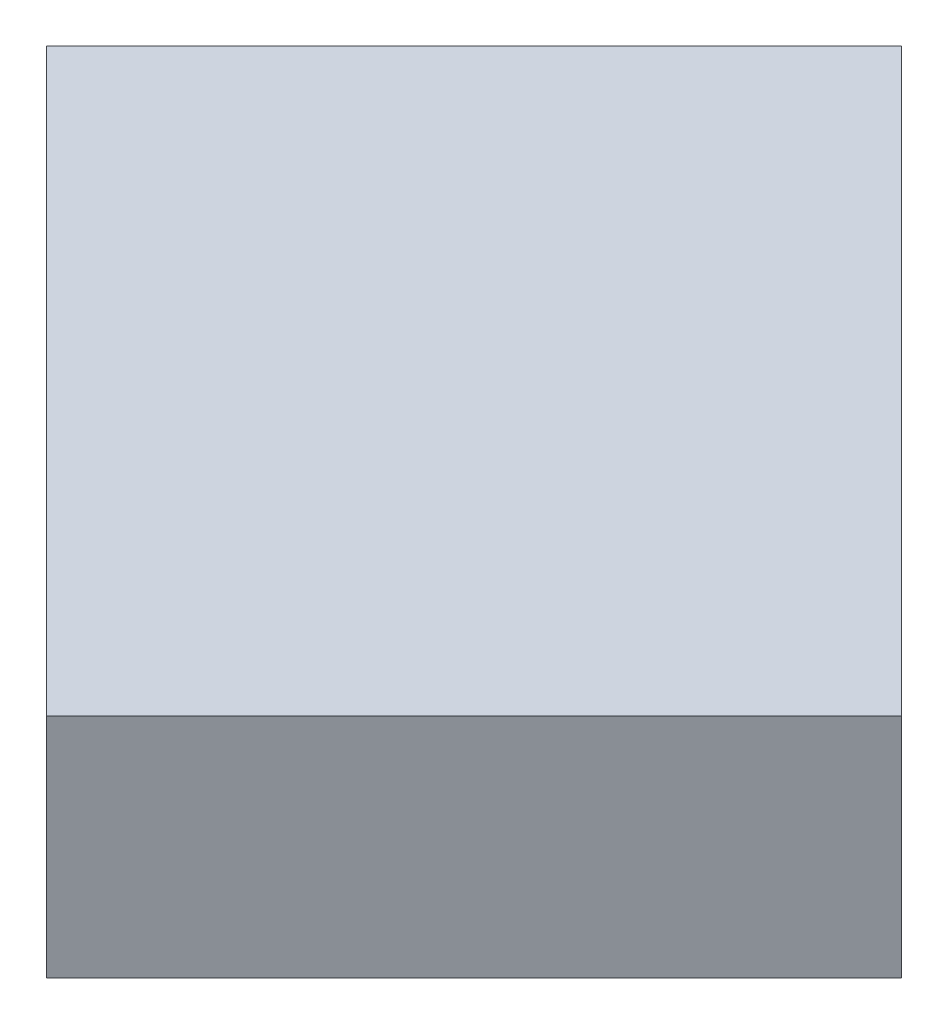
ISO-10303-21;
HEADER;
FILE_DESCRIPTION(('STEP AP214'),'2;1');
FILE_NAME('part.step','',(''),(''),'','','');
FILE_SCHEMA(('AUTOMOTIVE_DESIGN { 1 0 10303 214 1 1 1 1 }'));
ENDSEC;
DATA;
#1=APPLICATION_CONTEXT('core data for automotive mechanical design processes');
#2=APPLICATION_PROTOCOL_DEFINITION('international standard','automotive_design',2000,#1);
#3=PRODUCT_CONTEXT('',#1,'mechanical');
#4=PRODUCT('Part','Part','',(#3));
#5=PRODUCT_RELATED_PRODUCT_CATEGORY('part','',(#4));
#6=PRODUCT_DEFINITION_FORMATION('','',#4);
#7=PRODUCT_DEFINITION_CONTEXT('part definition',#1,'design');
#8=PRODUCT_DEFINITION('design','',#6,#7);
#9=PRODUCT_DEFINITION_SHAPE('','',#8);
#10=(LENGTH_UNIT() NAMED_UNIT(*) SI_UNIT(.MILLI.,.METRE.));
#11=(NAMED_UNIT(*) PLANE_ANGLE_UNIT() SI_UNIT($,.RADIAN.));
#12=(NAMED_UNIT(*) SI_UNIT($,.STERADIAN.) SOLID_ANGLE_UNIT());
#13=UNCERTAINTY_MEASURE_WITH_UNIT(LENGTH_MEASURE(1.E-05),#10,'distance_accuracy_value','');
#14=(GEOMETRIC_REPRESENTATION_CONTEXT(3) GLOBAL_UNCERTAINTY_ASSIGNED_CONTEXT((#13)) GLOBAL_UNIT_ASSIGNED_CONTEXT((#10,
#11,#12)) REPRESENTATION_CONTEXT('',''));
#15=CARTESIAN_POINT('',(0.,0.,0.));
#16=DIRECTION('',(0.,0.,1.));
#17=DIRECTION('',(1.,0.,0.));
#18=AXIS2_PLACEMENT_3D('',#15,#16,#17);
#19=CARTESIAN_POINT('',(-14.7078210486803,6.62,-2.22738636073754));
#20=DIRECTION('',(0.707106781186547,0.,0.707106781186548));
#21=DIRECTION('',(0.707106781186548,0.,-0.707106781186547));
#22=AXIS2_PLACEMENT_3D('',#19,#20,#21);
#23=PLANE('',#22);
#24=DIRECTION('',(-0.707106781186548,0.,0.707106781186547));
#25=VECTOR('',#24,1.);
#26=CARTESIAN_POINT('',(-14.7078210486803,0.,-2.22738636073754));
#27=LINE('',#26,#25);
#28=CARTESIAN_POINT('',(-2.22738636073752,0.,-14.7078210486803));
#29=VERTEX_POINT('',#28);
#30=CARTESIAN_POINT('',(-14.7078210486803,0.,-2.22738636073754));
#31=VERTEX_POINT('',#30);
#32=EDGE_CURVE('E101',#29,#31,#27,.T.);
#33=ORIENTED_EDGE('',*,*,#32,.T.);
#34=DIRECTION('',(0.,-1.,0.));
#35=VECTOR('',#34,1.);
#36=CARTESIAN_POINT('',(-14.7078210486803,6.62,-2.22738636073754));
#37=LINE('',#36,#35);
#38=CARTESIAN_POINT('',(-14.7078210486803,6.62,-2.22738636073754));
#39=VERTEX_POINT('',#38);
#40=EDGE_CURVE('E11',#39,#31,#37,.T.);
#41=ORIENTED_EDGE('',*,*,#40,.F.);
#42=DIRECTION('',(-0.707106781186548,0.,0.707106781186547));
#43=VECTOR('',#42,1.);
#44=CARTESIAN_POINT('',(-14.7078210486803,6.62,-2.22738636073754));
#45=LINE('',#44,#43);
#46=CARTESIAN_POINT('',(-2.22738636073752,6.62,-14.7078210486803));
#47=VERTEX_POINT('',#46);
#48=EDGE_CURVE('E89',#47,#39,#45,.T.);
#49=ORIENTED_EDGE('',*,*,#48,.F.);
#50=DIRECTION('',(0.,-1.,0.));
#51=VECTOR('',#50,1.);
#52=CARTESIAN_POINT('',(-2.22738636073752,6.62,-14.7078210486803));
#53=LINE('',#52,#51);
#54=EDGE_CURVE('E97',#47,#29,#53,.T.);
#55=ORIENTED_EDGE('',*,*,#54,.T.);
#56=EDGE_LOOP('',(#33,#41,#49,#55));
#57=FACE_BOUND('',#56,.T.);
#58=ADVANCED_FACE('F38',(#57),#23,.F.);
#59=CARTESIAN_POINT('',(-14.7078210486803,6.62,-2.22738636073754));
#60=DIRECTION('',(0.707106781186548,0.,-0.707106781186547));
#61=DIRECTION('',(-0.707106781186547,0.,-0.707106781186548));
#62=AXIS2_PLACEMENT_3D('',#59,#60,#61);
#63=PLANE('',#62);
#64=DIRECTION('',(0.707106781186547,0.,0.707106781186548));
#65=VECTOR('',#64,1.);
#66=CARTESIAN_POINT('',(-14.7078210486803,0.,-2.22738636073754));
#67=LINE('',#66,#65);
#68=CARTESIAN_POINT('',(2.22738636073751,0.,14.7078210486803));
#69=VERTEX_POINT('',#68);
#70=EDGE_CURVE('E93',#31,#69,#67,.T.);
#71=ORIENTED_EDGE('',*,*,#70,.T.);
#72=DIRECTION('',(0.,-1.,0.));
#73=VECTOR('',#72,1.);
#74=CARTESIAN_POINT('',(2.22738636073751,6.62,14.7078210486803));
#75=LINE('',#74,#73);
#76=CARTESIAN_POINT('',(2.22738636073751,6.62,14.7078210486803));
#77=VERTEX_POINT('',#76);
#78=EDGE_CURVE('E46',#77,#69,#75,.T.);
#79=ORIENTED_EDGE('',*,*,#78,.F.);
#80=DIRECTION('',(0.707106781186547,0.,0.707106781186548));
#81=VECTOR('',#80,1.);
#82=CARTESIAN_POINT('',(-14.7078210486803,6.62,-2.22738636073754));
#83=LINE('',#82,#81);
#84=EDGE_CURVE('E84',#39,#77,#83,.T.);
#85=ORIENTED_EDGE('',*,*,#84,.F.);
#86=ORIENTED_EDGE('',*,*,#40,.T.);
#87=EDGE_LOOP('',(#71,#79,#85,#86));
#88=FACE_BOUND('',#87,.T.);
#89=ADVANCED_FACE('F92',(#88),#63,.F.);
#90=CARTESIAN_POINT('',(2.22738636073751,6.62,14.7078210486803));
#91=DIRECTION('',(-0.707106781186547,0.,-0.707106781186548));
#92=DIRECTION('',(-0.707106781186548,0.,0.707106781186547));
#93=AXIS2_PLACEMENT_3D('',#90,#91,#92);
#94=PLANE('',#93);
#95=DIRECTION('',(0.707106781186548,0.,-0.707106781186547));
#96=VECTOR('',#95,1.);
#97=CARTESIAN_POINT('',(2.22738636073751,0.,14.7078210486803));
#98=LINE('',#97,#96);
#99=CARTESIAN_POINT('',(14.7078210486803,0.,2.22738636073752));
#100=VERTEX_POINT('',#99);
#101=EDGE_CURVE('E71',#69,#100,#98,.T.);
#102=ORIENTED_EDGE('',*,*,#101,.T.);
#103=DIRECTION('',(0.,-1.,0.));
#104=VECTOR('',#103,1.);
#105=CARTESIAN_POINT('',(14.7078210486803,6.62,2.22738636073752));
#106=LINE('',#105,#104);
#107=CARTESIAN_POINT('',(14.7078210486803,6.62,2.22738636073752));
#108=VERTEX_POINT('',#107);
#109=EDGE_CURVE('E94',#108,#100,#106,.T.);
#110=ORIENTED_EDGE('',*,*,#109,.F.);
#111=DIRECTION('',(0.707106781186548,0.,-0.707106781186547));
#112=VECTOR('',#111,1.);
#113=CARTESIAN_POINT('',(2.22738636073751,6.62,14.7078210486803));
#114=LINE('',#113,#112);
#115=EDGE_CURVE('E87',#77,#108,#114,.T.);
#116=ORIENTED_EDGE('',*,*,#115,.F.);
#117=ORIENTED_EDGE('',*,*,#78,.T.);
#118=EDGE_LOOP('',(#102,#110,#116,#117));
#119=FACE_BOUND('',#118,.T.);
#120=ADVANCED_FACE('F95',(#119),#94,.F.);
#121=CARTESIAN_POINT('',(-2.22738636073752,6.62,-14.7078210486803));
#122=DIRECTION('',(-0.707106781186548,0.,0.707106781186547));
#123=DIRECTION('',(0.707106781186547,0.,0.707106781186548));
#124=AXIS2_PLACEMENT_3D('',#121,#122,#123);
#125=PLANE('',#124);
#126=DIRECTION('',(-0.707106781186547,0.,-0.707106781186548));
#127=VECTOR('',#126,1.);
#128=CARTESIAN_POINT('',(-2.22738636073752,0.,-14.7078210486803));
#129=LINE('',#128,#127);
#130=EDGE_CURVE('E77',#100,#29,#129,.T.);
#131=ORIENTED_EDGE('',*,*,#130,.T.);
#132=ORIENTED_EDGE('',*,*,#54,.F.);
#133=DIRECTION('',(-0.707106781186547,0.,-0.707106781186548));
#134=VECTOR('',#133,1.);
#135=CARTESIAN_POINT('',(-2.22738636073752,6.62,-14.7078210486803));
#136=LINE('',#135,#134);
#137=EDGE_CURVE('E54',#108,#47,#136,.T.);
#138=ORIENTED_EDGE('',*,*,#137,.F.);
#139=ORIENTED_EDGE('',*,*,#109,.T.);
#140=EDGE_LOOP('',(#131,#132,#138,#139));
#141=FACE_BOUND('',#140,.T.);
#142=ADVANCED_FACE('F108',(#141),#125,.F.);
#143=CARTESIAN_POINT('',(0.,6.62,0.));
#144=DIRECTION('',(0.,-1.,0.));
#145=DIRECTION('',(0.,0.,-1.));
#146=AXIS2_PLACEMENT_3D('',#143,#144,#145);
#147=PLANE('',#146);
#148=ORIENTED_EDGE('',*,*,#48,.T.);
#149=ORIENTED_EDGE('',*,*,#84,.T.);
#150=ORIENTED_EDGE('',*,*,#115,.T.);
#151=ORIENTED_EDGE('',*,*,#137,.T.);
#152=EDGE_LOOP('',(#148,#149,#150,#151));
#153=FACE_BOUND('',#152,.T.);
#154=ADVANCED_FACE('F85',(#153),#147,.F.);
#155=CARTESIAN_POINT('',(0.,0.,0.));
#156=DIRECTION('',(0.,-1.,0.));
#157=DIRECTION('',(0.,0.,-1.));
#158=AXIS2_PLACEMENT_3D('',#155,#156,#157);
#159=PLANE('',#158);
#160=ORIENTED_EDGE('',*,*,#32,.F.);
#161=ORIENTED_EDGE('',*,*,#130,.F.);
#162=ORIENTED_EDGE('',*,*,#101,.F.);
#163=ORIENTED_EDGE('',*,*,#70,.F.);
#164=EDGE_LOOP('',(#160,#161,#162,#163));
#165=FACE_BOUND('',#164,.T.);
#166=ADVANCED_FACE('F111',(#165),#159,.T.);
#167=CLOSED_SHELL('',(#58,#89,#120,#142,#154,#166));
#168=MANIFOLD_SOLID_BREP('B2',#167);
#169=ADVANCED_BREP_SHAPE_REPRESENTATION('',(#18,#168),#14);
#170=SHAPE_DEFINITION_REPRESENTATION(#9,#169);
ENDSEC;
END-ISO-10303-21;
